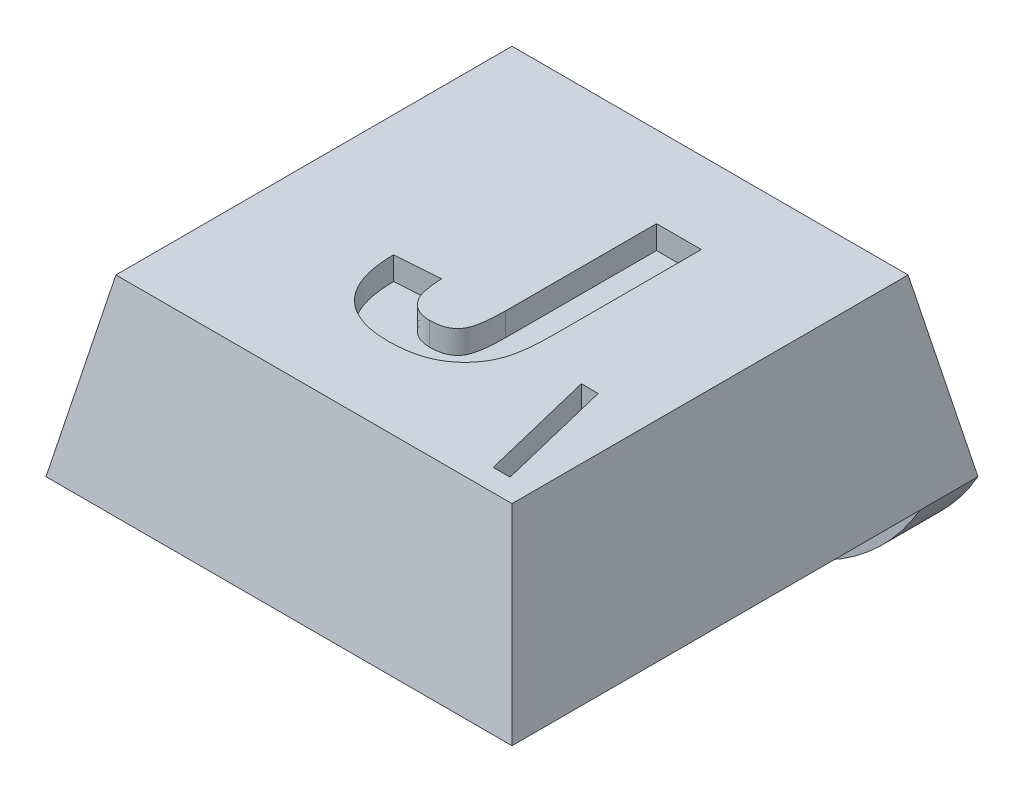
ISO-10303-21;
HEADER;
FILE_DESCRIPTION(('STEP AP214'),'2;1');
FILE_NAME('part.step','',(''),(''),'','','');
FILE_SCHEMA(('AUTOMOTIVE_DESIGN { 1 0 10303 214 1 1 1 1 }'));
ENDSEC;
DATA;
#1=APPLICATION_CONTEXT('core data for automotive mechanical design processes');
#2=APPLICATION_PROTOCOL_DEFINITION('international standard','automotive_design',2000,#1);
#3=PRODUCT_CONTEXT('',#1,'mechanical');
#4=PRODUCT('Part','Part','',(#3));
#5=PRODUCT_RELATED_PRODUCT_CATEGORY('part','',(#4));
#6=PRODUCT_DEFINITION_FORMATION('','',#4);
#7=PRODUCT_DEFINITION_CONTEXT('part definition',#1,'design');
#8=PRODUCT_DEFINITION('design','',#6,#7);
#9=PRODUCT_DEFINITION_SHAPE('','',#8);
#10=(LENGTH_UNIT() NAMED_UNIT(*) SI_UNIT(.MILLI.,.METRE.));
#11=(NAMED_UNIT(*) PLANE_ANGLE_UNIT() SI_UNIT($,.RADIAN.));
#12=(NAMED_UNIT(*) SI_UNIT($,.STERADIAN.) SOLID_ANGLE_UNIT());
#13=UNCERTAINTY_MEASURE_WITH_UNIT(LENGTH_MEASURE(1.E-05),#10,'distance_accuracy_value','');
#14=(GEOMETRIC_REPRESENTATION_CONTEXT(3) GLOBAL_UNCERTAINTY_ASSIGNED_CONTEXT((#13)) GLOBAL_UNIT_ASSIGNED_CONTEXT((#10,
#11,#12)) REPRESENTATION_CONTEXT('',''));
#15=CARTESIAN_POINT('',(0.,0.,0.));
#16=DIRECTION('',(0.,0.,1.));
#17=DIRECTION('',(1.,0.,0.));
#18=AXIS2_PLACEMENT_3D('',#15,#16,#17);
#19=CARTESIAN_POINT('',(0.,3.,0.));
#20=DIRECTION('',(0.,-1.,0.));
#21=DIRECTION('',(0.,0.,-1.));
#22=AXIS2_PLACEMENT_3D('',#19,#20,#21);
#23=PLANE('',#22);
#24=DIRECTION('',(0.,0.,-1.));
#25=VECTOR('',#24,1.);
#26=CARTESIAN_POINT('',(4.47863523599211,3.,-3.41391404386237));
#27=LINE('',#26,#25);
#28=CARTESIAN_POINT('',(4.47863523599211,3.,-3.41391404386237));
#29=VERTEX_POINT('',#28);
#30=CARTESIAN_POINT('',(4.47863523599211,3.,-6.00285635155468));
#31=VERTEX_POINT('',#30);
#32=EDGE_CURVE('E67',#29,#31,#27,.T.);
#33=ORIENTED_EDGE('',*,*,#32,.T.);
#34=DIRECTION('',(1.,0.,0.));
#35=VECTOR('',#34,1.);
#36=CARTESIAN_POINT('',(4.47863523599211,3.,-6.00285635155468));
#37=LINE('',#36,#35);
#38=CARTESIAN_POINT('',(5.24786600522288,3.,-6.00285635155468));
#39=VERTEX_POINT('',#38);
#40=EDGE_CURVE('E215',#31,#39,#37,.T.);
#41=ORIENTED_EDGE('',*,*,#40,.T.);
#42=DIRECTION('',(0.,0.,1.));
#43=VECTOR('',#42,1.);
#44=CARTESIAN_POINT('',(5.24786600522288,3.,-6.00285635155468));
#45=LINE('',#44,#43);
#46=CARTESIAN_POINT('',(5.24786600522288,3.,-3.48122173617007));
#47=VERTEX_POINT('',#46);
#48=EDGE_CURVE('E503',#39,#47,#45,.T.);
#49=ORIENTED_EDGE('',*,*,#48,.T.);
#50=CARTESIAN_POINT('',(5.24786600522288,3.,-3.48122173617007));
#51=CARTESIAN_POINT('',(5.24752225511572,3.,-3.44115386886636));
#52=CARTESIAN_POINT('',(5.2468552055461,3.,-3.36340188251499));
#53=CARTESIAN_POINT('',(5.24275650156162,3.,-3.25039046502719));
#54=CARTESIAN_POINT('',(5.23665832133049,3.,-3.14454193046868));
#55=CARTESIAN_POINT('',(5.22727722213507,3.,-3.04587147100803));
#56=CARTESIAN_POINT('',(5.21405872026987,3.,-2.95459238833429));
#57=CARTESIAN_POINT('',(5.20004986677814,3.,-2.86997657489744));
#58=CARTESIAN_POINT('',(5.18304142709716,3.,-2.79245169237198));
#59=CARTESIAN_POINT('',(5.16780003561618,3.,-2.74395130585806));
#60=CARTESIAN_POINT('',(5.16052626163313,3.,-2.7208050695034));
#61=B_SPLINE_CURVE_WITH_KNOTS('',3,(#50,#51,#52,#53,#54,#55,#56,#57,#58,#59,#60),.UNSPECIFIED.,
.F.,.F.,(4,1,1,1,1,1,1,1,4),(0.,0.156452495119165,0.303597198546586,0.441515756123935,
0.57040444623701,0.690463066411908,0.801567510862614,0.905300439354285,1.),.UNSPECIFIED.);
#62=CARTESIAN_POINT('',(5.16052626163313,3.,-2.7208050695034));
#63=VERTEX_POINT('',#62);
#64=EDGE_CURVE('E507',#47,#63,#61,.T.);
#65=ORIENTED_EDGE('',*,*,#64,.T.);
#66=CARTESIAN_POINT('',(5.16052626163313,3.,-2.7208050695034));
#67=CARTESIAN_POINT('',(5.15036108111888,3.,-2.69228260075384));
#68=CARTESIAN_POINT('',(5.13024360189988,3.,-2.63583498808826));
#69=CARTESIAN_POINT('',(5.09114165266873,3.,-2.55531488098573));
#70=CARTESIAN_POINT('',(5.04617643068522,3.,-2.47908431540956));
#71=CARTESIAN_POINT('',(4.9954744836834,3.,-2.40681293841355));
#72=CARTESIAN_POINT('',(4.93951471700895,3.,-2.3382109873061));
#73=CARTESIAN_POINT('',(4.87639907650832,3.,-2.27508664932136));
#74=CARTESIAN_POINT('',(4.80834779956692,3.,-2.21523809822528));
#75=CARTESIAN_POINT('',(4.73344668122952,3.,-2.16114528886516));
#76=CARTESIAN_POINT('',(4.65358079146145,3.,-2.11070979383156));
#77=CARTESIAN_POINT('',(4.56647505050752,3.,-2.06868896260535));
#78=CARTESIAN_POINT('',(4.47384329891444,3.,-2.03234038710198));
#79=CARTESIAN_POINT('',(4.37490810397317,3.,-2.00281662788184));
#80=CARTESIAN_POINT('',(4.26964077765763,3.,-1.97971607285242));
#81=CARTESIAN_POINT('',(4.15831100110899,3.,-1.96290189406509));
#82=CARTESIAN_POINT('',(4.04077046567442,3.,-1.95334773003709));
#83=CARTESIAN_POINT('',(3.96049016407211,3.,-1.95217527382871));
#84=CARTESIAN_POINT('',(3.91934036419724,3.,-1.95157430027263));
#85=B_SPLINE_CURVE_WITH_KNOTS('',3,(#66,#67,#68,#69,#70,#71,#72,#73,#74,#75,#76,#77,#78,#79,#80,
#81,#82,#83,#84),.UNSPECIFIED.,.F.,.F.,(4,1,1,1,1,1,1,1,1,1,1,1,1,1,1,1,4),(0.,
0.0578458170130587,0.114480212135457,0.170784536242213,0.226875480201814,0.283096404177707,
0.339779109412981,0.397319931612097,0.456142184292489,0.516216371074673,0.577640129433395,
0.640691136416188,0.706271339139874,0.77477558408517,0.846550476911842,0.921345373149547,1.),.UNSPECIFIED.);
#86=CARTESIAN_POINT('',(3.91934036419724,3.,-1.95157430027263));
#87=VERTEX_POINT('',#86);
#88=EDGE_CURVE('E513',#63,#87,#85,.T.);
#89=ORIENTED_EDGE('',*,*,#88,.T.);
#90=CARTESIAN_POINT('',(3.91934036419724,3.,-1.95157430027263));
#91=CARTESIAN_POINT('',(3.87122552775589,3.,-1.95273721135087));
#92=CARTESIAN_POINT('',(3.77768594443229,3.,-1.95499801541353));
#93=CARTESIAN_POINT('',(3.64166147511049,3.,-1.9700076897214));
#94=CARTESIAN_POINT('',(3.51410056447315,3.,-1.99626024238106));
#95=CARTESIAN_POINT('',(3.39538704832291,3.,-2.03417967545256));
#96=CARTESIAN_POINT('',(3.28430787386042,3.,-2.08131717039047));
#97=CARTESIAN_POINT('',(3.18220656089415,3.,-2.14011472571528));
#98=CARTESIAN_POINT('',(3.08854047676782,3.,-2.20939270114689));
#99=CARTESIAN_POINT('',(3.00391871149983,3.,-2.28936343112476));
#100=CARTESIAN_POINT('',(2.92829943263745,3.,-2.37921821520504));
#101=CARTESIAN_POINT('',(2.86302647475674,3.,-2.47974541520825));
#102=CARTESIAN_POINT('',(2.80762711961946,3.,-2.5898937430363));
#103=CARTESIAN_POINT('',(2.76298469212978,3.,-2.71016150555024));
#104=CARTESIAN_POINT('',(2.72773939671791,3.,-2.8399729134613));
#105=CARTESIAN_POINT('',(2.7023174618641,3.,-2.97960128819225));
#106=CARTESIAN_POINT('',(2.68714789434325,3.,-3.12912613406769));
#107=CARTESIAN_POINT('',(2.68491317155468,3.,-3.23198720027981));
#108=CARTESIAN_POINT('',(2.68376344112031,3.,-3.28490763360596));
#109=B_SPLINE_CURVE_WITH_KNOTS('',3,(#90,#91,#92,#93,#94,#95,#96,#97,#98,#99,#100,#101,#102,
#103,#104,#105,#106,#107,#108),.UNSPECIFIED.,.F.,.F.,(4,1,1,1,1,1,1,1,1,1,1,1,1,1,1,1,4),(0.,
0.0696292858637476,0.135365614195809,0.197756356389333,0.257779246829448,0.315436810851021,
0.372058901761518,0.427875728209648,0.483657745283362,0.540176831628515,0.597427412819986,
0.65672025189341,0.718247696480561,0.782762362646519,0.851147772011753,0.923417822731319,1.),.UNSPECIFIED.);
#110=CARTESIAN_POINT('',(2.68376344112031,3.,-3.28490763360596));
#111=VERTEX_POINT('',#110);
#112=EDGE_CURVE('E522',#87,#111,#109,.T.);
#113=ORIENTED_EDGE('',*,*,#112,.T.);
#114=DIRECTION('',(0.997785157856609,0.,-0.0665190105237744));
#115=VECTOR('',#114,1.);
#116=CARTESIAN_POINT('',(2.68376344112031,3.,-3.28490763360596));
#117=LINE('',#116,#115);
#118=CARTESIAN_POINT('',(3.45299421035108,3.,-3.33618968488802));
#119=VERTEX_POINT('',#118);
#120=EDGE_CURVE('E531',#111,#119,#117,.T.);
#121=ORIENTED_EDGE('',*,*,#120,.T.);
#122=CARTESIAN_POINT('',(3.45299421035108,3.,-3.33618968488802));
#123=CARTESIAN_POINT('',(3.45437576720145,3.,-3.30786259790295));
#124=CARTESIAN_POINT('',(3.45702497993634,3.,-3.25354382009574));
#125=CARTESIAN_POINT('',(3.46438093481815,3.,-3.17524086648235));
#126=CARTESIAN_POINT('',(3.47368268694616,3.,-3.10327127682234));
#127=CARTESIAN_POINT('',(3.48585383717944,3.,-3.03785106374312));
#128=CARTESIAN_POINT('',(3.49896082283715,3.,-2.97842744402968));
#129=CARTESIAN_POINT('',(3.51598700225223,3.,-2.9261698568959));
#130=CARTESIAN_POINT('',(3.53388655569812,3.,-2.87924076853295));
#131=CARTESIAN_POINT('',(3.54960838745535,3.,-2.85178351122112));
#132=CARTESIAN_POINT('',(3.55716087701775,3.,-2.83859353104186));
#133=B_SPLINE_CURVE_WITH_KNOTS('',3,(#122,#123,#124,#125,#126,#127,#128,#129,#130,#131,#132),
.UNSPECIFIED.,.F.,.F.,(4,1,1,1,1,1,1,1,4),(0.,0.165826153270336,0.317980948018504,
0.459795738565099,0.589996550393839,0.707065953418222,0.815243566739462,0.911246281264675,1.),.UNSPECIFIED.);
#134=CARTESIAN_POINT('',(3.55716087701775,3.,-2.83859353104186));
#135=VERTEX_POINT('',#134);
#136=EDGE_CURVE('E538',#119,#135,#133,.T.);
#137=ORIENTED_EDGE('',*,*,#136,.T.);
#138=CARTESIAN_POINT('',(3.55716087701775,3.,-2.83859353104186));
#139=CARTESIAN_POINT('',(3.56872297026109,3.,-2.82114812140039));
#140=CARTESIAN_POINT('',(3.5914786098731,3.,-2.78681338232417));
#141=CARTESIAN_POINT('',(3.63299092938756,3.,-2.74207160503994));
#142=CARTESIAN_POINT('',(3.67755853703033,3.,-2.70295584275881));
#143=CARTESIAN_POINT('',(3.7276195539163,3.,-2.67220300867414));
#144=CARTESIAN_POINT('',(3.78178052727939,3.,-2.64801682943951));
#145=CARTESIAN_POINT('',(3.84044803681409,3.,-2.63044224953724));
#146=CARTESIAN_POINT('',(3.90346033058215,3.,-2.61978585285303));
#147=CARTESIAN_POINT('',(3.94680846284558,3.,-2.61876437011324));
#148=CARTESIAN_POINT('',(3.96901985137672,3.,-2.6182409669393));
#149=B_SPLINE_CURVE_WITH_KNOTS('',3,(#138,#139,#140,#141,#142,#143,#144,#145,#146,#147,#148),
.UNSPECIFIED.,.F.,.F.,(4,1,1,1,1,1,1,1,4),(0.,0.127957288456737,0.251835881320901,
0.372465314870914,0.490006212112382,0.610068863669226,0.734765287953249,0.864094923273421,1.),.UNSPECIFIED.);
#150=CARTESIAN_POINT('',(3.96901985137672,3.,-2.6182409669393));
#151=VERTEX_POINT('',#150);
#152=EDGE_CURVE('E544',#135,#151,#149,.T.);
#153=ORIENTED_EDGE('',*,*,#152,.T.);
#154=CARTESIAN_POINT('',(3.96901985137672,3.,-2.6182409669393));
#155=CARTESIAN_POINT('',(3.99147724775292,3.,-2.61865945316102));
#156=CARTESIAN_POINT('',(4.03464752738319,3.,-2.61946391717416));
#157=CARTESIAN_POINT('',(4.09686091011261,3.,-2.62677921913698));
#158=CARTESIAN_POINT('',(4.15406303340528,3.,-2.63863282439469));
#159=CARTESIAN_POINT('',(4.20628505369981,3.,-2.65529485624049));
#160=CARTESIAN_POINT('',(4.25370386751579,3.,-2.6769246227107));
#161=CARTESIAN_POINT('',(4.29526839276369,3.,-2.7045961658879));
#162=CARTESIAN_POINT('',(4.33276968959403,3.,-2.73573291501313));
#163=CARTESIAN_POINT('',(4.3651648902046,3.,-2.77318826399133));
#164=CARTESIAN_POINT('',(4.3927662355869,3.,-2.81831895728671));
#165=CARTESIAN_POINT('',(4.41581210499667,3.,-2.87324896159926));
#166=CARTESIAN_POINT('',(4.43563784023723,3.,-2.93820422141634));
#167=CARTESIAN_POINT('',(4.45096017752995,3.,-3.01367854972563));
#168=CARTESIAN_POINT('',(4.46400250876483,3.,-3.09894939887271));
#169=CARTESIAN_POINT('',(4.47218369239211,3.,-3.19477071558805));
#170=CARTESIAN_POINT('',(4.4780643862916,3.,-3.30085929507591));
#171=CARTESIAN_POINT('',(4.47843963391815,3.,-3.375175750204));
#172=CARTESIAN_POINT('',(4.47863523599211,3.,-3.41391404386237));
#173=B_SPLINE_CURVE_WITH_KNOTS('',3,(#154,#155,#156,#157,#158,#159,#160,#161,#162,#163,#164,
#165,#166,#167,#168,#169,#170,#171,#172),.UNSPECIFIED.,.F.,.F.,(4,1,1,1,1,1,1,1,1,1,1,1,1,1,1,1,
4),(0.,0.0612696766946458,0.117779863322363,0.170676728222519,0.220468992129151,
0.267103819976365,0.312391821648745,0.356352173127523,0.399759083159082,0.446892572188991,
0.500109905692333,0.561902028042048,0.631955790870925,0.7100982931769,0.797211503732284,
0.894294200316469,1.),.UNSPECIFIED.);
#174=EDGE_CURVE('E226',#151,#29,#173,.T.);
#175=ORIENTED_EDGE('',*,*,#174,.T.);
#176=EDGE_LOOP('',(#33,#41,#49,#65,#89,#113,#121,#137,#153,#175));
#177=FACE_BOUND('',#176,.T.);
#178=DIRECTION('',(-1.,0.,0.));
#179=VECTOR('',#178,1.);
#180=CARTESIAN_POINT('',(11.,3.,-0.6));
#181=LINE('',#180,#179);
#182=CARTESIAN_POINT('',(7.4,3.,-0.6));
#183=VERTEX_POINT('',#182);
#184=CARTESIAN_POINT('',(0.6,3.,-0.6));
#185=VERTEX_POINT('',#184);
#186=EDGE_CURVE('E355',#183,#185,#181,.T.);
#187=ORIENTED_EDGE('',*,*,#186,.F.);
#188=DIRECTION('',(0.,0.,1.));
#189=VECTOR('',#188,1.);
#190=CARTESIAN_POINT('',(7.4,3.,-8.));
#191=LINE('',#190,#189);
#192=CARTESIAN_POINT('',(7.4,3.,-7.4));
#193=VERTEX_POINT('',#192);
#194=EDGE_CURVE('E368',#193,#183,#191,.T.);
#195=ORIENTED_EDGE('',*,*,#194,.F.);
#196=DIRECTION('',(-1.,0.,0.));
#197=VECTOR('',#196,1.);
#198=CARTESIAN_POINT('',(11.,3.,-7.4));
#199=LINE('',#198,#197);
#200=CARTESIAN_POINT('',(0.599999999999999,3.,-7.4));
#201=VERTEX_POINT('',#200);
#202=EDGE_CURVE('E351',#193,#201,#199,.T.);
#203=ORIENTED_EDGE('',*,*,#202,.T.);
#204=DIRECTION('',(0.,0.,1.));
#205=VECTOR('',#204,1.);
#206=CARTESIAN_POINT('',(0.6,3.,-8.));
#207=LINE('',#206,#205);
#208=EDGE_CURVE('E371',#201,#185,#207,.T.);
#209=ORIENTED_EDGE('',*,*,#208,.T.);
#210=EDGE_LOOP('',(#187,#195,#203,#209));
#211=FACE_BOUND('',#210,.T.);
#212=DIRECTION('',(-0.23685313162707,0.,-0.9715454667891));
#213=VECTOR('',#212,1.);
#214=CARTESIAN_POINT('',(6.70029877777824,3.,-0.97731022127194));
#215=LINE('',#214,#213);
#216=CARTESIAN_POINT('',(6.70029877777824,3.,-0.97731022127194));
#217=VERTEX_POINT('',#216);
#218=CARTESIAN_POINT('',(6.21271864957311,3.,-2.97731022127194));
#219=VERTEX_POINT('',#218);
#220=EDGE_CURVE('E59',#217,#219,#215,.T.);
#221=ORIENTED_EDGE('',*,*,#220,.T.);
#222=DIRECTION('',(1.,0.,0.));
#223=VECTOR('',#222,1.);
#224=CARTESIAN_POINT('',(6.21271864957311,3.,-2.97731022127194));
#225=LINE('',#224,#223);
#226=CARTESIAN_POINT('',(6.50278275213721,3.,-2.97731022127194));
#227=VERTEX_POINT('',#226);
#228=EDGE_CURVE('E209',#219,#227,#225,.T.);
#229=ORIENTED_EDGE('',*,*,#228,.T.);
#230=DIRECTION('',(0.23666941653505,0.,0.971590236301785));
#231=VECTOR('',#230,1.);
#232=CARTESIAN_POINT('',(6.50278275213721,3.,-2.97731022127194));
#233=LINE('',#232,#231);
#234=CARTESIAN_POINT('',(6.9899622393167,3.,-0.97731022127194));
#235=VERTEX_POINT('',#234);
#236=EDGE_CURVE('E440',#227,#235,#233,.T.);
#237=ORIENTED_EDGE('',*,*,#236,.T.);
#238=DIRECTION('',(-1.,0.,0.));
#239=VECTOR('',#238,1.);
#240=CARTESIAN_POINT('',(6.9899622393167,3.,-0.97731022127194));
#241=LINE('',#240,#239);
#242=EDGE_CURVE('E205',#235,#217,#241,.T.);
#243=ORIENTED_EDGE('',*,*,#242,.T.);
#244=EDGE_LOOP('',(#221,#229,#237,#243));
#245=FACE_BOUND('',#244,.T.);
#246=ADVANCED_FACE('F43',(#177,#211,#245),#23,.F.);
#247=CARTESIAN_POINT('',(8.,0.,-8.));
#248=DIRECTION('',(-0.98058067569092,-0.196116135138184,0.));
#249=DIRECTION('',(0.196116135138184,-0.98058067569092,0.));
#250=AXIS2_PLACEMENT_3D('',#247,#248,#249);
#251=PLANE('',#250);
#252=DIRECTION('',(-0.192450089729875,0.962250448649376,-0.192450089729875));
#253=VECTOR('',#252,1.);
#254=CARTESIAN_POINT('',(7.7037037037037,1.48148148148148,-0.296296296296296));
#255=LINE('',#254,#253);
#256=CARTESIAN_POINT('',(8.,0.,0.));
#257=VERTEX_POINT('',#256);
#258=EDGE_CURVE('E365',#257,#183,#255,.T.);
#259=ORIENTED_EDGE('',*,*,#258,.F.);
#260=DIRECTION('',(0.,0.,-1.));
#261=VECTOR('',#260,1.);
#262=CARTESIAN_POINT('',(8.,0.,0.));
#263=LINE('',#262,#261);
#264=CARTESIAN_POINT('',(8.,0.,-7.));
#265=VERTEX_POINT('',#264);
#266=EDGE_CURVE('E382',#257,#265,#263,.T.);
#267=ORIENTED_EDGE('',*,*,#266,.T.);
#268=DIRECTION('',(0.,0.,1.));
#269=VECTOR('',#268,1.);
#270=CARTESIAN_POINT('',(8.,0.,-8.));
#271=LINE('',#270,#269);
#272=CARTESIAN_POINT('',(8.,0.,-8.));
#273=VERTEX_POINT('',#272);
#274=EDGE_CURVE('E317',#273,#265,#271,.T.);
#275=ORIENTED_EDGE('',*,*,#274,.F.);
#276=DIRECTION('',(0.192450089729875,-0.962250448649376,-0.192450089729875));
#277=VECTOR('',#276,1.);
#278=CARTESIAN_POINT('',(8.,0.,-8.));
#279=LINE('',#278,#277);
#280=EDGE_CURVE('E358',#193,#273,#279,.T.);
#281=ORIENTED_EDGE('',*,*,#280,.F.);
#282=ORIENTED_EDGE('',*,*,#194,.T.);
#283=EDGE_LOOP('',(#259,#267,#275,#281,#282));
#284=FACE_BOUND('',#283,.T.);
#285=ADVANCED_FACE('F298',(#284),#251,.F.);
#286=CARTESIAN_POINT('',(0.,0.,-8.));
#287=DIRECTION('',(0.98058067569092,-0.196116135138184,0.));
#288=DIRECTION('',(0.196116135138184,0.98058067569092,0.));
#289=AXIS2_PLACEMENT_3D('',#286,#287,#288);
#290=PLANE('',#289);
#291=DIRECTION('',(-0.192450089729875,-0.962250448649376,0.192450089729875));
#292=VECTOR('',#291,1.);
#293=CARTESIAN_POINT('',(0.296296296296296,1.48148148148148,-0.296296296296296));
#294=LINE('',#293,#292);
#295=CARTESIAN_POINT('',(0.,0.,0.));
#296=VERTEX_POINT('',#295);
#297=EDGE_CURVE('E407',#185,#296,#294,.T.);
#298=ORIENTED_EDGE('',*,*,#297,.F.);
#299=ORIENTED_EDGE('',*,*,#208,.F.);
#300=DIRECTION('',(0.192450089729875,0.962250448649376,0.192450089729875));
#301=VECTOR('',#300,1.);
#302=CARTESIAN_POINT('',(0.,0.,-8.));
#303=LINE('',#302,#301);
#304=CARTESIAN_POINT('',(0.,0.,-8.));
#305=VERTEX_POINT('',#304);
#306=EDGE_CURVE('E381',#305,#201,#303,.T.);
#307=ORIENTED_EDGE('',*,*,#306,.F.);
#308=DIRECTION('',(0.,0.,1.));
#309=VECTOR('',#308,1.);
#310=CARTESIAN_POINT('',(0.,0.,0.));
#311=LINE('',#310,#309);
#312=CARTESIAN_POINT('',(0.,0.,-7.));
#313=VERTEX_POINT('',#312);
#314=EDGE_CURVE('E386',#305,#313,#311,.T.);
#315=ORIENTED_EDGE('',*,*,#314,.T.);
#316=EDGE_CURVE('E375',#313,#296,#311,.T.);
#317=ORIENTED_EDGE('',*,*,#316,.T.);
#318=EDGE_LOOP('',(#298,#299,#307,#315,#317));
#319=FACE_BOUND('',#318,.T.);
#320=ADVANCED_FACE('F295',(#319),#290,.F.);
#321=CARTESIAN_POINT('',(0.,0.,0.));
#322=DIRECTION('',(0.,-1.,0.));
#323=DIRECTION('',(0.,0.,-1.));
#324=AXIS2_PLACEMENT_3D('',#321,#322,#323);
#325=PLANE('',#324);
#326=DIRECTION('',(-1.,0.,0.));
#327=VECTOR('',#326,1.);
#328=CARTESIAN_POINT('',(0.,0.,-7.));
#329=LINE('',#328,#327);
#330=EDGE_CURVE('E333',#265,#313,#329,.T.);
#331=ORIENTED_EDGE('',*,*,#330,.F.);
#332=ORIENTED_EDGE('',*,*,#266,.F.);
#333=DIRECTION('',(1.,0.,0.));
#334=VECTOR('',#333,1.);
#335=CARTESIAN_POINT('',(0.,0.,0.));
#336=LINE('',#335,#334);
#337=EDGE_CURVE('E383',#296,#257,#336,.T.);
#338=ORIENTED_EDGE('',*,*,#337,.F.);
#339=ORIENTED_EDGE('',*,*,#316,.F.);
#340=EDGE_LOOP('',(#331,#332,#338,#339));
#341=FACE_BOUND('',#340,.T.);
#342=CARTESIAN_POINT('',(4.,0.,-3.75));
#343=DIRECTION('',(0.,-1.,0.));
#344=DIRECTION('',(0.,0.,-1.));
#345=AXIS2_PLACEMENT_3D('',#342,#343,#344);
#346=CIRCLE('',#345,1.75);
#347=CARTESIAN_POINT('',(4.,0.,-5.5));
#348=VERTEX_POINT('',#347);
#349=EDGE_CURVE('E337',#348,#348,#346,.T.);
#350=ORIENTED_EDGE('',*,*,#349,.F.);
#351=EDGE_LOOP('',(#350));
#352=FACE_BOUND('',#351,.T.);
#353=ADVANCED_FACE('F293',(#341,#352),#325,.T.);
#354=CARTESIAN_POINT('',(11.,3.,-7.4));
#355=DIRECTION('',(0.,0.196116135138184,-0.98058067569092));
#356=DIRECTION('',(0.,0.98058067569092,0.196116135138184));
#357=AXIS2_PLACEMENT_3D('',#354,#355,#356);
#358=PLANE('',#357);
#359=ORIENTED_EDGE('',*,*,#280,.T.);
#360=DIRECTION('',(-1.,0.,0.));
#361=VECTOR('',#360,1.);
#362=CARTESIAN_POINT('',(0.,0.,-8.));
#363=LINE('',#362,#361);
#364=EDGE_CURVE('E325',#273,#305,#363,.T.);
#365=ORIENTED_EDGE('',*,*,#364,.T.);
#366=ORIENTED_EDGE('',*,*,#306,.T.);
#367=ORIENTED_EDGE('',*,*,#202,.F.);
#368=EDGE_LOOP('',(#359,#365,#366,#367));
#369=FACE_BOUND('',#368,.T.);
#370=ADVANCED_FACE('F289',(#369),#358,.T.);
#371=CARTESIAN_POINT('',(11.,0.,0.));
#372=DIRECTION('',(0.,0.196116135138184,0.98058067569092));
#373=DIRECTION('',(0.,-0.98058067569092,0.196116135138184));
#374=AXIS2_PLACEMENT_3D('',#371,#372,#373);
#375=PLANE('',#374);
#376=ORIENTED_EDGE('',*,*,#258,.T.);
#377=ORIENTED_EDGE('',*,*,#186,.T.);
#378=ORIENTED_EDGE('',*,*,#297,.T.);
#379=ORIENTED_EDGE('',*,*,#337,.T.);
#380=EDGE_LOOP('',(#376,#377,#378,#379));
#381=FACE_BOUND('',#380,.T.);
#382=ADVANCED_FACE('F285',(#381),#375,.T.);
#383=CARTESIAN_POINT('',(4.,0.4,-3.75));
#384=DIRECTION('',(0.,-1.,0.));
#385=DIRECTION('',(0.,0.,-1.));
#386=AXIS2_PLACEMENT_3D('',#383,#384,#385);
#387=CYLINDRICAL_SURFACE('',#386,1.75);
#388=CARTESIAN_POINT('',(4.,0.4,-3.75));
#389=DIRECTION('',(0.,-1.,0.));
#390=DIRECTION('',(0.,0.,-1.));
#391=AXIS2_PLACEMENT_3D('',#388,#389,#390);
#392=CIRCLE('',#391,1.75);
#393=CARTESIAN_POINT('',(4.,0.4,-5.5));
#394=VERTEX_POINT('',#393);
#395=EDGE_CURVE('E347',#394,#394,#392,.T.);
#396=ORIENTED_EDGE('',*,*,#395,.F.);
#397=EDGE_LOOP('',(#396));
#398=FACE_BOUND('',#397,.T.);
#399=ORIENTED_EDGE('',*,*,#349,.T.);
#400=EDGE_LOOP('',(#399));
#401=FACE_BOUND('',#400,.T.);
#402=ADVANCED_FACE('F281',(#398,#401),#387,.F.);
#403=CARTESIAN_POINT('',(4.,0.4,-3.75));
#404=DIRECTION('',(0.,-1.,0.));
#405=DIRECTION('',(0.,0.,-1.));
#406=AXIS2_PLACEMENT_3D('',#403,#404,#405);
#407=PLANE('',#406);
#408=ORIENTED_EDGE('',*,*,#395,.T.);
#409=EDGE_LOOP('',(#408));
#410=FACE_BOUND('',#409,.T.);
#411=ADVANCED_FACE('F277',(#410),#407,.T.);
#412=CARTESIAN_POINT('',(0.,-2.,-8.));
#413=DIRECTION('',(0.,0.,1.));
#414=DIRECTION('',(1.,0.,0.));
#415=AXIS2_PLACEMENT_3D('',#412,#413,#414);
#416=PLANE('',#415);
#417=ORIENTED_EDGE('',*,*,#364,.F.);
#418=CARTESIAN_POINT('',(4.53589838486225,2.,-8.));
#419=DIRECTION('',(0.,0.,1.));
#420=DIRECTION('',(1.,0.,0.));
#421=AXIS2_PLACEMENT_3D('',#418,#419,#420);
#422=CIRCLE('',#421,4.);
#423=CARTESIAN_POINT('',(4.53589838486225,-2.,-8.));
#424=VERTEX_POINT('',#423);
#425=EDGE_CURVE('E11',#273,#424,#422,.F.);
#426=ORIENTED_EDGE('',*,*,#425,.T.);
#427=DIRECTION('',(1.,0.,0.));
#428=VECTOR('',#427,1.);
#429=CARTESIAN_POINT('',(0.,-2.,-8.));
#430=LINE('',#429,#428);
#431=CARTESIAN_POINT('',(3.46410161513775,-2.,-8.));
#432=VERTEX_POINT('',#431);
#433=EDGE_CURVE('E323',#432,#424,#430,.T.);
#434=ORIENTED_EDGE('',*,*,#433,.F.);
#435=CARTESIAN_POINT('',(3.46410161513775,2.,-8.));
#436=DIRECTION('',(0.,0.,1.));
#437=DIRECTION('',(1.,0.,0.));
#438=AXIS2_PLACEMENT_3D('',#435,#436,#437);
#439=CIRCLE('',#438,4.);
#440=EDGE_CURVE('E52',#432,#305,#439,.F.);
#441=ORIENTED_EDGE('',*,*,#440,.T.);
#442=EDGE_LOOP('',(#417,#426,#434,#441));
#443=FACE_BOUND('',#442,.T.);
#444=ADVANCED_FACE('F273',(#443),#416,.F.);
#445=CARTESIAN_POINT('',(0.,-2.,-7.));
#446=DIRECTION('',(0.,0.,-1.));
#447=DIRECTION('',(-1.,0.,0.));
#448=AXIS2_PLACEMENT_3D('',#445,#446,#447);
#449=PLANE('',#448);
#450=DIRECTION('',(-1.,0.,0.));
#451=VECTOR('',#450,1.);
#452=CARTESIAN_POINT('',(0.,-2.,-7.));
#453=LINE('',#452,#451);
#454=CARTESIAN_POINT('',(4.53589838486225,-2.,-7.));
#455=VERTEX_POINT('',#454);
#456=CARTESIAN_POINT('',(3.46410161513775,-2.,-7.));
#457=VERTEX_POINT('',#456);
#458=EDGE_CURVE('E332',#455,#457,#453,.T.);
#459=ORIENTED_EDGE('',*,*,#458,.F.);
#460=CARTESIAN_POINT('',(4.53589838486225,2.,-7.));
#461=DIRECTION('',(0.,0.,-1.));
#462=DIRECTION('',(-1.,0.,0.));
#463=AXIS2_PLACEMENT_3D('',#460,#461,#462);
#464=CIRCLE('',#463,4.);
#465=EDGE_CURVE('E413',#455,#265,#464,.F.);
#466=ORIENTED_EDGE('',*,*,#465,.T.);
#467=ORIENTED_EDGE('',*,*,#330,.T.);
#468=CARTESIAN_POINT('',(3.46410161513775,2.,-7.));
#469=DIRECTION('',(0.,0.,-1.));
#470=DIRECTION('',(-1.,0.,0.));
#471=AXIS2_PLACEMENT_3D('',#468,#469,#470);
#472=CIRCLE('',#471,4.);
#473=EDGE_CURVE('E410',#313,#457,#472,.F.);
#474=ORIENTED_EDGE('',*,*,#473,.T.);
#475=EDGE_LOOP('',(#459,#466,#467,#474));
#476=FACE_BOUND('',#475,.T.);
#477=ADVANCED_FACE('F269',(#476),#449,.F.);
#478=CARTESIAN_POINT('',(0.,-2.,0.));
#479=DIRECTION('',(0.,1.,0.));
#480=DIRECTION('',(0.,0.,1.));
#481=AXIS2_PLACEMENT_3D('',#478,#479,#480);
#482=PLANE('',#481);
#483=ORIENTED_EDGE('',*,*,#433,.T.);
#484=DIRECTION('',(0.,0.,1.));
#485=VECTOR('',#484,1.);
#486=CARTESIAN_POINT('',(4.53589838486225,-2.,0.));
#487=LINE('',#486,#485);
#488=EDGE_CURVE('E319',#424,#455,#487,.T.);
#489=ORIENTED_EDGE('',*,*,#488,.T.);
#490=ORIENTED_EDGE('',*,*,#458,.T.);
#491=DIRECTION('',(0.,0.,-1.));
#492=VECTOR('',#491,1.);
#493=CARTESIAN_POINT('',(3.46410161513775,-2.,0.));
#494=LINE('',#493,#492);
#495=EDGE_CURVE('E330',#457,#432,#494,.T.);
#496=ORIENTED_EDGE('',*,*,#495,.T.);
#497=EDGE_LOOP('',(#483,#489,#490,#496));
#498=FACE_BOUND('',#497,.T.);
#499=ADVANCED_FACE('F265',(#498),#482,.F.);
#500=CARTESIAN_POINT('',(4.53589838486225,2.,-8.));
#501=DIRECTION('',(0.,0.,1.));
#502=DIRECTION('',(1.,0.,0.));
#503=AXIS2_PLACEMENT_3D('',#500,#501,#502);
#504=CYLINDRICAL_SURFACE('',#503,4.);
#505=ORIENTED_EDGE('',*,*,#425,.F.);
#506=ORIENTED_EDGE('',*,*,#274,.T.);
#507=ORIENTED_EDGE('',*,*,#465,.F.);
#508=ORIENTED_EDGE('',*,*,#488,.F.);
#509=EDGE_LOOP('',(#505,#506,#507,#508));
#510=FACE_BOUND('',#509,.T.);
#511=ADVANCED_FACE('F268',(#510),#504,.T.);
#512=CARTESIAN_POINT('',(3.46410161513775,2.,-8.));
#513=DIRECTION('',(0.,0.,-1.));
#514=DIRECTION('',(-1.,0.,0.));
#515=AXIS2_PLACEMENT_3D('',#512,#513,#514);
#516=CYLINDRICAL_SURFACE('',#515,4.);
#517=ORIENTED_EDGE('',*,*,#473,.F.);
#518=ORIENTED_EDGE('',*,*,#314,.F.);
#519=ORIENTED_EDGE('',*,*,#440,.F.);
#520=ORIENTED_EDGE('',*,*,#495,.F.);
#521=EDGE_LOOP('',(#517,#518,#519,#520));
#522=FACE_BOUND('',#521,.T.);
#523=ADVANCED_FACE('F45',(#522),#516,.T.);
#524=CARTESIAN_POINT('',(4.47863523599211,2.6,-3.41391404386237));
#525=DIRECTION('',(1.,0.,0.));
#526=DIRECTION('',(0.,0.,-1.));
#527=AXIS2_PLACEMENT_3D('',#524,#525,#526);
#528=PLANE('',#527);
#529=ORIENTED_EDGE('',*,*,#32,.F.);
#530=DIRECTION('',(0.,1.,0.));
#531=VECTOR('',#530,1.);
#532=CARTESIAN_POINT('',(4.47863523599211,2.6,-3.41391404386237));
#533=LINE('',#532,#531);
#534=CARTESIAN_POINT('',(4.47863523599211,2.6,-3.41391404386237));
#535=VERTEX_POINT('',#534);
#536=EDGE_CURVE('E490',#535,#29,#533,.T.);
#537=ORIENTED_EDGE('',*,*,#536,.F.);
#538=DIRECTION('',(0.,0.,-1.));
#539=VECTOR('',#538,1.);
#540=CARTESIAN_POINT('',(4.47863523599211,2.6,-3.41391404386237));
#541=LINE('',#540,#539);
#542=CARTESIAN_POINT('',(4.47863523599211,2.6,-6.00285635155468));
#543=VERTEX_POINT('',#542);
#544=EDGE_CURVE('E221',#535,#543,#541,.T.);
#545=ORIENTED_EDGE('',*,*,#544,.T.);
#546=DIRECTION('',(0.,1.,0.));
#547=VECTOR('',#546,1.);
#548=CARTESIAN_POINT('',(4.47863523599211,2.6,-6.00285635155468));
#549=LINE('',#548,#547);
#550=EDGE_CURVE('E342',#543,#31,#549,.T.);
#551=ORIENTED_EDGE('',*,*,#550,.T.);
#552=EDGE_LOOP('',(#529,#537,#545,#551));
#553=FACE_BOUND('',#552,.T.);
#554=ADVANCED_FACE('F261',(#553),#528,.T.);
#555=CARTESIAN_POINT('',(4.47863523599211,2.6,-6.00285635155468));
#556=DIRECTION('',(0.,0.,1.));
#557=DIRECTION('',(1.,0.,0.));
#558=AXIS2_PLACEMENT_3D('',#555,#556,#557);
#559=PLANE('',#558);
#560=ORIENTED_EDGE('',*,*,#40,.F.);
#561=ORIENTED_EDGE('',*,*,#550,.F.);
#562=DIRECTION('',(1.,0.,0.));
#563=VECTOR('',#562,1.);
#564=CARTESIAN_POINT('',(4.47863523599211,2.6,-6.00285635155468));
#565=LINE('',#564,#563);
#566=CARTESIAN_POINT('',(5.24786600522288,2.6,-6.00285635155468));
#567=VERTEX_POINT('',#566);
#568=EDGE_CURVE('E225',#543,#567,#565,.T.);
#569=ORIENTED_EDGE('',*,*,#568,.T.);
#570=DIRECTION('',(0.,1.,0.));
#571=VECTOR('',#570,1.);
#572=CARTESIAN_POINT('',(5.24786600522288,2.6,-6.00285635155468));
#573=LINE('',#572,#571);
#574=EDGE_CURVE('E586',#567,#39,#573,.T.);
#575=ORIENTED_EDGE('',*,*,#574,.T.);
#576=EDGE_LOOP('',(#560,#561,#569,#575));
#577=FACE_BOUND('',#576,.T.);
#578=ADVANCED_FACE('F257',(#577),#559,.T.);
#579=CARTESIAN_POINT('',(5.24786600522288,2.6,-6.00285635155468));
#580=DIRECTION('',(-1.,0.,0.));
#581=DIRECTION('',(0.,0.,1.));
#582=AXIS2_PLACEMENT_3D('',#579,#580,#581);
#583=PLANE('',#582);
#584=ORIENTED_EDGE('',*,*,#48,.F.);
#585=ORIENTED_EDGE('',*,*,#574,.F.);
#586=DIRECTION('',(0.,0.,1.));
#587=VECTOR('',#586,1.);
#588=CARTESIAN_POINT('',(5.24786600522288,2.6,-6.00285635155468));
#589=LINE('',#588,#587);
#590=CARTESIAN_POINT('',(5.24786600522288,2.6,-3.48122173617007));
#591=VERTEX_POINT('',#590);
#592=EDGE_CURVE('E229',#567,#591,#589,.T.);
#593=ORIENTED_EDGE('',*,*,#592,.T.);
#594=DIRECTION('',(0.,1.,0.));
#595=VECTOR('',#594,1.);
#596=CARTESIAN_POINT('',(5.24786600522288,2.6,-3.48122173617007));
#597=LINE('',#596,#595);
#598=EDGE_CURVE('E584',#591,#47,#597,.T.);
#599=ORIENTED_EDGE('',*,*,#598,.T.);
#600=EDGE_LOOP('',(#584,#585,#593,#599));
#601=FACE_BOUND('',#600,.T.);
#602=ADVANCED_FACE('F252',(#601),#583,.T.);
#603=CARTESIAN_POINT('',(5.24786600522288,2.6,-3.48122173617007));
#604=CARTESIAN_POINT('',(5.24752225511572,2.6,-3.44115386886636));
#605=CARTESIAN_POINT('',(5.2468552055461,2.6,-3.36340188251499));
#606=CARTESIAN_POINT('',(5.24275650156162,2.6,-3.25039046502719));
#607=CARTESIAN_POINT('',(5.23665832133049,2.6,-3.14454193046868));
#608=CARTESIAN_POINT('',(5.22727722213507,2.6,-3.04587147100803));
#609=CARTESIAN_POINT('',(5.21405872026987,2.6,-2.95459238833429));
#610=CARTESIAN_POINT('',(5.20004986677814,2.6,-2.86997657489744));
#611=CARTESIAN_POINT('',(5.18304142709716,2.6,-2.79245169237198));
#612=CARTESIAN_POINT('',(5.16780003561618,2.6,-2.74395130585806));
#613=CARTESIAN_POINT('',(5.16052626163313,2.6,-2.7208050695034));
#614=B_SPLINE_CURVE_WITH_KNOTS('',3,(#603,#604,#605,#606,#607,#608,#609,#610,#611,#612,#613),
.UNSPECIFIED.,.F.,.F.,(4,1,1,1,1,1,1,1,4),(0.,0.156452495119165,0.303597198546586,
0.441515756123935,0.57040444623701,0.690463066411908,0.801567510862614,0.905300439354285,1.),.UNSPECIFIED.);
#615=DIRECTION('',(0.,1.,0.));
#616=VECTOR('',#615,1.);
#617=SURFACE_OF_LINEAR_EXTRUSION('',#614,#616);
#618=ORIENTED_EDGE('',*,*,#64,.F.);
#619=ORIENTED_EDGE('',*,*,#598,.F.);
#620=CARTESIAN_POINT('',(5.16052626163313,2.6,-2.7208050695034));
#621=VERTEX_POINT('',#620);
#622=EDGE_CURVE('E232',#591,#621,#614,.T.);
#623=ORIENTED_EDGE('',*,*,#622,.T.);
#624=DIRECTION('',(0.,1.,0.));
#625=VECTOR('',#624,1.);
#626=CARTESIAN_POINT('',(5.16052626163313,2.6,-2.7208050695034));
#627=LINE('',#626,#625);
#628=EDGE_CURVE('E581',#621,#63,#627,.T.);
#629=ORIENTED_EDGE('',*,*,#628,.T.);
#630=EDGE_LOOP('',(#618,#619,#623,#629));
#631=FACE_BOUND('',#630,.T.);
#632=ADVANCED_FACE('F247',(#631),#617,.T.);
#633=CARTESIAN_POINT('',(5.16052626163313,2.6,-2.7208050695034));
#634=CARTESIAN_POINT('',(5.15036108111888,2.6,-2.69228260075384));
#635=CARTESIAN_POINT('',(5.13024360189988,2.6,-2.63583498808826));
#636=CARTESIAN_POINT('',(5.09114165266873,2.6,-2.55531488098573));
#637=CARTESIAN_POINT('',(5.04617643068522,2.6,-2.47908431540956));
#638=CARTESIAN_POINT('',(4.9954744836834,2.6,-2.40681293841355));
#639=CARTESIAN_POINT('',(4.93951471700895,2.6,-2.3382109873061));
#640=CARTESIAN_POINT('',(4.87639907650832,2.6,-2.27508664932136));
#641=CARTESIAN_POINT('',(4.80834779956692,2.6,-2.21523809822528));
#642=CARTESIAN_POINT('',(4.73344668122952,2.6,-2.16114528886516));
#643=CARTESIAN_POINT('',(4.65358079146145,2.6,-2.11070979383156));
#644=CARTESIAN_POINT('',(4.56647505050752,2.6,-2.06868896260535));
#645=CARTESIAN_POINT('',(4.47384329891444,2.6,-2.03234038710198));
#646=CARTESIAN_POINT('',(4.37490810397317,2.6,-2.00281662788184));
#647=CARTESIAN_POINT('',(4.26964077765763,2.6,-1.97971607285242));
#648=CARTESIAN_POINT('',(4.15831100110899,2.6,-1.96290189406509));
#649=CARTESIAN_POINT('',(4.04077046567442,2.6,-1.95334773003709));
#650=CARTESIAN_POINT('',(3.96049016407211,2.6,-1.95217527382871));
#651=CARTESIAN_POINT('',(3.91934036419724,2.6,-1.95157430027263));
#652=B_SPLINE_CURVE_WITH_KNOTS('',3,(#633,#634,#635,#636,#637,#638,#639,#640,#641,#642,#643,
#644,#645,#646,#647,#648,#649,#650,#651),.UNSPECIFIED.,.F.,.F.,(4,1,1,1,1,1,1,1,1,1,1,1,1,1,1,1,
4),(0.,0.0578458170130587,0.114480212135457,0.170784536242213,0.226875480201814,
0.283096404177707,0.339779109412981,0.397319931612097,0.456142184292489,0.516216371074673,
0.577640129433395,0.640691136416188,0.706271339139874,0.77477558408517,0.846550476911842,
0.921345373149547,1.),.UNSPECIFIED.);
#653=DIRECTION('',(0.,1.,0.));
#654=VECTOR('',#653,1.);
#655=SURFACE_OF_LINEAR_EXTRUSION('',#652,#654);
#656=ORIENTED_EDGE('',*,*,#88,.F.);
#657=ORIENTED_EDGE('',*,*,#628,.F.);
#658=CARTESIAN_POINT('',(3.91934036419724,2.6,-1.95157430027263));
#659=VERTEX_POINT('',#658);
#660=EDGE_CURVE('E238',#621,#659,#652,.T.);
#661=ORIENTED_EDGE('',*,*,#660,.T.);
#662=DIRECTION('',(0.,1.,0.));
#663=VECTOR('',#662,1.);
#664=CARTESIAN_POINT('',(3.91934036419724,2.6,-1.95157430027263));
#665=LINE('',#664,#663);
#666=EDGE_CURVE('E578',#659,#87,#665,.T.);
#667=ORIENTED_EDGE('',*,*,#666,.T.);
#668=EDGE_LOOP('',(#656,#657,#661,#667));
#669=FACE_BOUND('',#668,.T.);
#670=ADVANCED_FACE('F251',(#669),#655,.T.);
#671=CARTESIAN_POINT('',(3.91934036419724,2.6,-1.95157430027263));
#672=CARTESIAN_POINT('',(3.87122552775589,2.6,-1.95273721135087));
#673=CARTESIAN_POINT('',(3.77768594443229,2.6,-1.95499801541353));
#674=CARTESIAN_POINT('',(3.64166147511049,2.6,-1.9700076897214));
#675=CARTESIAN_POINT('',(3.51410056447315,2.6,-1.99626024238106));
#676=CARTESIAN_POINT('',(3.39538704832291,2.6,-2.03417967545256));
#677=CARTESIAN_POINT('',(3.28430787386042,2.6,-2.08131717039047));
#678=CARTESIAN_POINT('',(3.18220656089415,2.6,-2.14011472571528));
#679=CARTESIAN_POINT('',(3.08854047676782,2.6,-2.20939270114689));
#680=CARTESIAN_POINT('',(3.00391871149983,2.6,-2.28936343112476));
#681=CARTESIAN_POINT('',(2.92829943263745,2.6,-2.37921821520504));
#682=CARTESIAN_POINT('',(2.86302647475674,2.6,-2.47974541520825));
#683=CARTESIAN_POINT('',(2.80762711961946,2.6,-2.5898937430363));
#684=CARTESIAN_POINT('',(2.76298469212978,2.6,-2.71016150555024));
#685=CARTESIAN_POINT('',(2.72773939671791,2.6,-2.8399729134613));
#686=CARTESIAN_POINT('',(2.7023174618641,2.6,-2.97960128819225));
#687=CARTESIAN_POINT('',(2.68714789434325,2.6,-3.12912613406769));
#688=CARTESIAN_POINT('',(2.68491317155468,2.6,-3.23198720027981));
#689=CARTESIAN_POINT('',(2.68376344112031,2.6,-3.28490763360596));
#690=B_SPLINE_CURVE_WITH_KNOTS('',3,(#671,#672,#673,#674,#675,#676,#677,#678,#679,#680,#681,
#682,#683,#684,#685,#686,#687,#688,#689),.UNSPECIFIED.,.F.,.F.,(4,1,1,1,1,1,1,1,1,1,1,1,1,1,1,1,
4),(0.,0.0696292858637476,0.135365614195809,0.197756356389333,0.257779246829448,
0.315436810851021,0.372058901761518,0.427875728209648,0.483657745283362,0.540176831628515,
0.597427412819986,0.65672025189341,0.718247696480561,0.782762362646519,0.851147772011753,
0.923417822731319,1.),.UNSPECIFIED.);
#691=DIRECTION('',(0.,1.,0.));
#692=VECTOR('',#691,1.);
#693=SURFACE_OF_LINEAR_EXTRUSION('',#690,#692);
#694=ORIENTED_EDGE('',*,*,#112,.F.);
#695=ORIENTED_EDGE('',*,*,#666,.F.);
#696=CARTESIAN_POINT('',(2.68376344112031,2.6,-3.28490763360596));
#697=VERTEX_POINT('',#696);
#698=EDGE_CURVE('E628',#659,#697,#690,.T.);
#699=ORIENTED_EDGE('',*,*,#698,.T.);
#700=DIRECTION('',(0.,1.,0.));
#701=VECTOR('',#700,1.);
#702=CARTESIAN_POINT('',(2.68376344112031,2.6,-3.28490763360596));
#703=LINE('',#702,#701);
#704=EDGE_CURVE('E575',#697,#111,#703,.T.);
#705=ORIENTED_EDGE('',*,*,#704,.T.);
#706=EDGE_LOOP('',(#694,#695,#699,#705));
#707=FACE_BOUND('',#706,.T.);
#708=ADVANCED_FACE('F610',(#707),#693,.T.);
#709=CARTESIAN_POINT('',(2.68376344112031,2.6,-3.28490763360596));
#710=DIRECTION('',(0.0665190105237744,0.,0.997785157856609));
#711=DIRECTION('',(0.997785157856609,0.,-0.0665190105237744));
#712=AXIS2_PLACEMENT_3D('',#709,#710,#711);
#713=PLANE('',#712);
#714=ORIENTED_EDGE('',*,*,#120,.F.);
#715=ORIENTED_EDGE('',*,*,#704,.F.);
#716=DIRECTION('',(0.997785157856609,0.,-0.0665190105237744));
#717=VECTOR('',#716,1.);
#718=CARTESIAN_POINT('',(2.68376344112031,2.6,-3.28490763360596));
#719=LINE('',#718,#717);
#720=CARTESIAN_POINT('',(3.45299421035108,2.6,-3.33618968488802));
#721=VERTEX_POINT('',#720);
#722=EDGE_CURVE('E618',#697,#721,#719,.T.);
#723=ORIENTED_EDGE('',*,*,#722,.T.);
#724=DIRECTION('',(0.,1.,0.));
#725=VECTOR('',#724,1.);
#726=CARTESIAN_POINT('',(3.45299421035108,2.6,-3.33618968488802));
#727=LINE('',#726,#725);
#728=EDGE_CURVE('E572',#721,#119,#727,.T.);
#729=ORIENTED_EDGE('',*,*,#728,.T.);
#730=EDGE_LOOP('',(#714,#715,#723,#729));
#731=FACE_BOUND('',#730,.T.);
#732=ADVANCED_FACE('F615',(#731),#713,.T.);
#733=CARTESIAN_POINT('',(3.45299421035108,2.6,-3.33618968488802));
#734=CARTESIAN_POINT('',(3.45437576720145,2.6,-3.30786259790295));
#735=CARTESIAN_POINT('',(3.45702497993634,2.6,-3.25354382009574));
#736=CARTESIAN_POINT('',(3.46438093481815,2.6,-3.17524086648235));
#737=CARTESIAN_POINT('',(3.47368268694616,2.6,-3.10327127682234));
#738=CARTESIAN_POINT('',(3.48585383717944,2.6,-3.03785106374312));
#739=CARTESIAN_POINT('',(3.49896082283715,2.6,-2.97842744402968));
#740=CARTESIAN_POINT('',(3.51598700225223,2.6,-2.9261698568959));
#741=CARTESIAN_POINT('',(3.53388655569812,2.6,-2.87924076853295));
#742=CARTESIAN_POINT('',(3.54960838745535,2.6,-2.85178351122112));
#743=CARTESIAN_POINT('',(3.55716087701775,2.6,-2.83859353104186));
#744=B_SPLINE_CURVE_WITH_KNOTS('',3,(#733,#734,#735,#736,#737,#738,#739,#740,#741,#742,#743),
.UNSPECIFIED.,.F.,.F.,(4,1,1,1,1,1,1,1,4),(0.,0.165826153270336,0.317980948018504,
0.459795738565099,0.589996550393839,0.707065953418222,0.815243566739462,0.911246281264675,1.),.UNSPECIFIED.);
#745=DIRECTION('',(0.,1.,0.));
#746=VECTOR('',#745,1.);
#747=SURFACE_OF_LINEAR_EXTRUSION('',#744,#746);
#748=ORIENTED_EDGE('',*,*,#136,.F.);
#749=ORIENTED_EDGE('',*,*,#728,.F.);
#750=CARTESIAN_POINT('',(3.55716087701775,2.6,-2.83859353104186));
#751=VERTEX_POINT('',#750);
#752=EDGE_CURVE('E623',#721,#751,#744,.T.);
#753=ORIENTED_EDGE('',*,*,#752,.T.);
#754=DIRECTION('',(0.,1.,0.));
#755=VECTOR('',#754,1.);
#756=CARTESIAN_POINT('',(3.55716087701775,2.6,-2.83859353104186));
#757=LINE('',#756,#755);
#758=EDGE_CURVE('E569',#751,#135,#757,.T.);
#759=ORIENTED_EDGE('',*,*,#758,.T.);
#760=EDGE_LOOP('',(#748,#749,#753,#759));
#761=FACE_BOUND('',#760,.T.);
#762=ADVANCED_FACE('F621',(#761),#747,.T.);
#763=CARTESIAN_POINT('',(3.55716087701775,2.6,-2.83859353104186));
#764=CARTESIAN_POINT('',(3.56872297026109,2.6,-2.82114812140039));
#765=CARTESIAN_POINT('',(3.5914786098731,2.6,-2.78681338232417));
#766=CARTESIAN_POINT('',(3.63299092938756,2.6,-2.74207160503994));
#767=CARTESIAN_POINT('',(3.67755853703033,2.6,-2.70295584275881));
#768=CARTESIAN_POINT('',(3.7276195539163,2.6,-2.67220300867414));
#769=CARTESIAN_POINT('',(3.78178052727939,2.6,-2.64801682943951));
#770=CARTESIAN_POINT('',(3.84044803681409,2.6,-2.63044224953724));
#771=CARTESIAN_POINT('',(3.90346033058215,2.6,-2.61978585285303));
#772=CARTESIAN_POINT('',(3.94680846284558,2.6,-2.61876437011324));
#773=CARTESIAN_POINT('',(3.96901985137672,2.6,-2.6182409669393));
#774=B_SPLINE_CURVE_WITH_KNOTS('',3,(#763,#764,#765,#766,#767,#768,#769,#770,#771,#772,#773),
.UNSPECIFIED.,.F.,.F.,(4,1,1,1,1,1,1,1,4),(0.,0.127957288456737,0.251835881320901,
0.372465314870914,0.490006212112382,0.610068863669226,0.734765287953249,0.864094923273421,1.),.UNSPECIFIED.);
#775=DIRECTION('',(0.,1.,0.));
#776=VECTOR('',#775,1.);
#777=SURFACE_OF_LINEAR_EXTRUSION('',#774,#776);
#778=ORIENTED_EDGE('',*,*,#152,.F.);
#779=ORIENTED_EDGE('',*,*,#758,.F.);
#780=CARTESIAN_POINT('',(3.96901985137672,2.6,-2.6182409669393));
#781=VERTEX_POINT('',#780);
#782=EDGE_CURVE('E491',#751,#781,#774,.T.);
#783=ORIENTED_EDGE('',*,*,#782,.T.);
#784=DIRECTION('',(0.,1.,0.));
#785=VECTOR('',#784,1.);
#786=CARTESIAN_POINT('',(3.96901985137672,2.6,-2.6182409669393));
#787=LINE('',#786,#785);
#788=EDGE_CURVE('E566',#781,#151,#787,.T.);
#789=ORIENTED_EDGE('',*,*,#788,.T.);
#790=EDGE_LOOP('',(#778,#779,#783,#789));
#791=FACE_BOUND('',#790,.T.);
#792=ADVANCED_FACE('F481',(#791),#777,.T.);
#793=CARTESIAN_POINT('',(3.96901985137672,2.6,-2.6182409669393));
#794=CARTESIAN_POINT('',(3.99147724775292,2.6,-2.61865945316102));
#795=CARTESIAN_POINT('',(4.03464752738319,2.6,-2.61946391717416));
#796=CARTESIAN_POINT('',(4.09686091011261,2.6,-2.62677921913698));
#797=CARTESIAN_POINT('',(4.15406303340528,2.6,-2.63863282439469));
#798=CARTESIAN_POINT('',(4.20628505369981,2.6,-2.65529485624049));
#799=CARTESIAN_POINT('',(4.25370386751579,2.6,-2.6769246227107));
#800=CARTESIAN_POINT('',(4.29526839276369,2.6,-2.7045961658879));
#801=CARTESIAN_POINT('',(4.33276968959403,2.6,-2.73573291501313));
#802=CARTESIAN_POINT('',(4.3651648902046,2.6,-2.77318826399133));
#803=CARTESIAN_POINT('',(4.3927662355869,2.6,-2.81831895728671));
#804=CARTESIAN_POINT('',(4.41581210499667,2.6,-2.87324896159926));
#805=CARTESIAN_POINT('',(4.43563784023723,2.6,-2.93820422141634));
#806=CARTESIAN_POINT('',(4.45096017752995,2.6,-3.01367854972563));
#807=CARTESIAN_POINT('',(4.46400250876483,2.6,-3.09894939887271));
#808=CARTESIAN_POINT('',(4.47218369239211,2.6,-3.19477071558805));
#809=CARTESIAN_POINT('',(4.4780643862916,2.6,-3.30085929507591));
#810=CARTESIAN_POINT('',(4.47843963391815,2.6,-3.375175750204));
#811=CARTESIAN_POINT('',(4.47863523599211,2.6,-3.41391404386237));
#812=B_SPLINE_CURVE_WITH_KNOTS('',3,(#793,#794,#795,#796,#797,#798,#799,#800,#801,#802,#803,
#804,#805,#806,#807,#808,#809,#810,#811),.UNSPECIFIED.,.F.,.F.,(4,1,1,1,1,1,1,1,1,1,1,1,1,1,1,1,
4),(0.,0.0612696766946458,0.117779863322363,0.170676728222519,0.220468992129151,
0.267103819976365,0.312391821648745,0.356352173127523,0.399759083159082,0.446892572188991,
0.500109905692333,0.561902028042048,0.631955790870925,0.7100982931769,0.797211503732284,
0.894294200316469,1.),.UNSPECIFIED.);
#813=DIRECTION('',(0.,1.,0.));
#814=VECTOR('',#813,1.);
#815=SURFACE_OF_LINEAR_EXTRUSION('',#812,#814);
#816=ORIENTED_EDGE('',*,*,#174,.F.);
#817=ORIENTED_EDGE('',*,*,#788,.F.);
#818=EDGE_CURVE('E485',#781,#535,#812,.T.);
#819=ORIENTED_EDGE('',*,*,#818,.T.);
#820=ORIENTED_EDGE('',*,*,#536,.T.);
#821=EDGE_LOOP('',(#816,#817,#819,#820));
#822=FACE_BOUND('',#821,.T.);
#823=ADVANCED_FACE('F476',(#822),#815,.T.);
#824=CARTESIAN_POINT('',(5.2320105200224,2.6,-3.09750566920284));
#825=DIRECTION('',(-9.37031804676301E-13,1.,0.));
#826=DIRECTION('',(-1.,-9.37031804676301E-13,0.));
#827=AXIS2_PLACEMENT_3D('',#824,#825,#826);
#828=PLANE('',#827);
#829=ORIENTED_EDGE('',*,*,#544,.F.);
#830=ORIENTED_EDGE('',*,*,#818,.F.);
#831=ORIENTED_EDGE('',*,*,#782,.F.);
#832=ORIENTED_EDGE('',*,*,#752,.F.);
#833=ORIENTED_EDGE('',*,*,#722,.F.);
#834=ORIENTED_EDGE('',*,*,#698,.F.);
#835=ORIENTED_EDGE('',*,*,#660,.F.);
#836=ORIENTED_EDGE('',*,*,#622,.F.);
#837=ORIENTED_EDGE('',*,*,#592,.F.);
#838=ORIENTED_EDGE('',*,*,#568,.F.);
#839=EDGE_LOOP('',(#829,#830,#831,#832,#833,#834,#835,#836,#837,#838));
#840=FACE_BOUND('',#839,.T.);
#841=ADVANCED_FACE('F473',(#840),#828,.T.);
#842=CARTESIAN_POINT('',(6.70029877777824,2.5,-0.97731022127194));
#843=DIRECTION('',(0.9715454667891,0.,-0.23685313162707));
#844=DIRECTION('',(-0.23685313162707,0.,-0.9715454667891));
#845=AXIS2_PLACEMENT_3D('',#842,#843,#844);
#846=PLANE('',#845);
#847=ORIENTED_EDGE('',*,*,#220,.F.);
#848=DIRECTION('',(0.,1.,0.));
#849=VECTOR('',#848,1.);
#850=CARTESIAN_POINT('',(6.70029877777824,2.5,-0.97731022127194));
#851=LINE('',#850,#849);
#852=CARTESIAN_POINT('',(6.70029877777824,2.5,-0.97731022127194));
#853=VERTEX_POINT('',#852);
#854=EDGE_CURVE('E203',#853,#217,#851,.T.);
#855=ORIENTED_EDGE('',*,*,#854,.F.);
#856=DIRECTION('',(-0.23685313162707,0.,-0.9715454667891));
#857=VECTOR('',#856,1.);
#858=CARTESIAN_POINT('',(6.70029877777824,2.5,-0.97731022127194));
#859=LINE('',#858,#857);
#860=CARTESIAN_POINT('',(6.21271864957311,2.5,-2.97731022127194));
#861=VERTEX_POINT('',#860);
#862=EDGE_CURVE('E194',#853,#861,#859,.T.);
#863=ORIENTED_EDGE('',*,*,#862,.T.);
#864=DIRECTION('',(0.,1.,0.));
#865=VECTOR('',#864,1.);
#866=CARTESIAN_POINT('',(6.21271864957311,2.5,-2.97731022127194));
#867=LINE('',#866,#865);
#868=EDGE_CURVE('E202',#861,#219,#867,.T.);
#869=ORIENTED_EDGE('',*,*,#868,.T.);
#870=EDGE_LOOP('',(#847,#855,#863,#869));
#871=FACE_BOUND('',#870,.T.);
#872=ADVANCED_FACE('F201',(#871),#846,.T.);
#873=CARTESIAN_POINT('',(6.21271864957311,2.5,-2.97731022127194));
#874=DIRECTION('',(0.,0.,1.));
#875=DIRECTION('',(1.,0.,0.));
#876=AXIS2_PLACEMENT_3D('',#873,#874,#875);
#877=PLANE('',#876);
#878=ORIENTED_EDGE('',*,*,#228,.F.);
#879=ORIENTED_EDGE('',*,*,#868,.F.);
#880=DIRECTION('',(1.,0.,0.));
#881=VECTOR('',#880,1.);
#882=CARTESIAN_POINT('',(6.21271864957311,2.5,-2.97731022127194));
#883=LINE('',#882,#881);
#884=CARTESIAN_POINT('',(6.50278275213721,2.5,-2.97731022127194));
#885=VERTEX_POINT('',#884);
#886=EDGE_CURVE('E190',#861,#885,#883,.T.);
#887=ORIENTED_EDGE('',*,*,#886,.T.);
#888=DIRECTION('',(0.,1.,0.));
#889=VECTOR('',#888,1.);
#890=CARTESIAN_POINT('',(6.50278275213721,2.5,-2.97731022127194));
#891=LINE('',#890,#889);
#892=EDGE_CURVE('E211',#885,#227,#891,.T.);
#893=ORIENTED_EDGE('',*,*,#892,.T.);
#894=EDGE_LOOP('',(#878,#879,#887,#893));
#895=FACE_BOUND('',#894,.T.);
#896=ADVANCED_FACE('F207',(#895),#877,.T.);
#897=CARTESIAN_POINT('',(6.50278275213721,2.5,-2.97731022127194));
#898=DIRECTION('',(-0.971590236301785,0.,0.23666941653505));
#899=DIRECTION('',(0.23666941653505,0.,0.971590236301785));
#900=AXIS2_PLACEMENT_3D('',#897,#898,#899);
#901=PLANE('',#900);
#902=ORIENTED_EDGE('',*,*,#236,.F.);
#903=ORIENTED_EDGE('',*,*,#892,.F.);
#904=DIRECTION('',(0.23666941653505,0.,0.971590236301785));
#905=VECTOR('',#904,1.);
#906=CARTESIAN_POINT('',(6.50278275213721,2.5,-2.97731022127194));
#907=LINE('',#906,#905);
#908=CARTESIAN_POINT('',(6.9899622393167,2.5,-0.97731022127194));
#909=VERTEX_POINT('',#908);
#910=EDGE_CURVE('E195',#885,#909,#907,.T.);
#911=ORIENTED_EDGE('',*,*,#910,.T.);
#912=DIRECTION('',(0.,1.,0.));
#913=VECTOR('',#912,1.);
#914=CARTESIAN_POINT('',(6.9899622393167,2.5,-0.97731022127194));
#915=LINE('',#914,#913);
#916=EDGE_CURVE('E217',#909,#235,#915,.T.);
#917=ORIENTED_EDGE('',*,*,#916,.T.);
#918=EDGE_LOOP('',(#902,#903,#911,#917));
#919=FACE_BOUND('',#918,.T.);
#920=ADVANCED_FACE('F455',(#919),#901,.T.);
#921=CARTESIAN_POINT('',(6.9899622393167,2.5,-0.97731022127194));
#922=DIRECTION('',(0.,0.,-1.));
#923=DIRECTION('',(-1.,0.,0.));
#924=AXIS2_PLACEMENT_3D('',#921,#922,#923);
#925=PLANE('',#924);
#926=ORIENTED_EDGE('',*,*,#242,.F.);
#927=ORIENTED_EDGE('',*,*,#916,.F.);
#928=DIRECTION('',(-1.,0.,0.));
#929=VECTOR('',#928,1.);
#930=CARTESIAN_POINT('',(6.9899622393167,2.5,-0.97731022127194));
#931=LINE('',#930,#929);
#932=EDGE_CURVE('E443',#909,#853,#931,.T.);
#933=ORIENTED_EDGE('',*,*,#932,.T.);
#934=ORIENTED_EDGE('',*,*,#854,.T.);
#935=EDGE_LOOP('',(#926,#927,#933,#934));
#936=FACE_BOUND('',#935,.T.);
#937=ADVANCED_FACE('F457',(#936),#925,.T.);
#938=CARTESIAN_POINT('',(0.,2.5,0.));
#939=DIRECTION('',(0.,-1.,0.));
#940=DIRECTION('',(0.,0.,-1.));
#941=AXIS2_PLACEMENT_3D('',#938,#939,#940);
#942=PLANE('',#941);
#943=ORIENTED_EDGE('',*,*,#862,.F.);
#944=ORIENTED_EDGE('',*,*,#932,.F.);
#945=ORIENTED_EDGE('',*,*,#910,.F.);
#946=ORIENTED_EDGE('',*,*,#886,.F.);
#947=EDGE_LOOP('',(#943,#944,#945,#946));
#948=FACE_BOUND('',#947,.T.);
#949=ADVANCED_FACE('F192',(#948),#942,.F.);
#950=CLOSED_SHELL('',(#246,#285,#320,#353,#370,#382,#402,#411,#444,#477,#499,#511,#523,#554,
#578,#602,#632,#670,#708,#732,#762,#792,#823,#841,#872,#896,#920,#937,#949));
#951=MANIFOLD_SOLID_BREP('B2',#950);
#952=ADVANCED_BREP_SHAPE_REPRESENTATION('',(#18,#951),#14);
#953=SHAPE_DEFINITION_REPRESENTATION(#9,#952);
ENDSEC;
END-ISO-10303-21;
